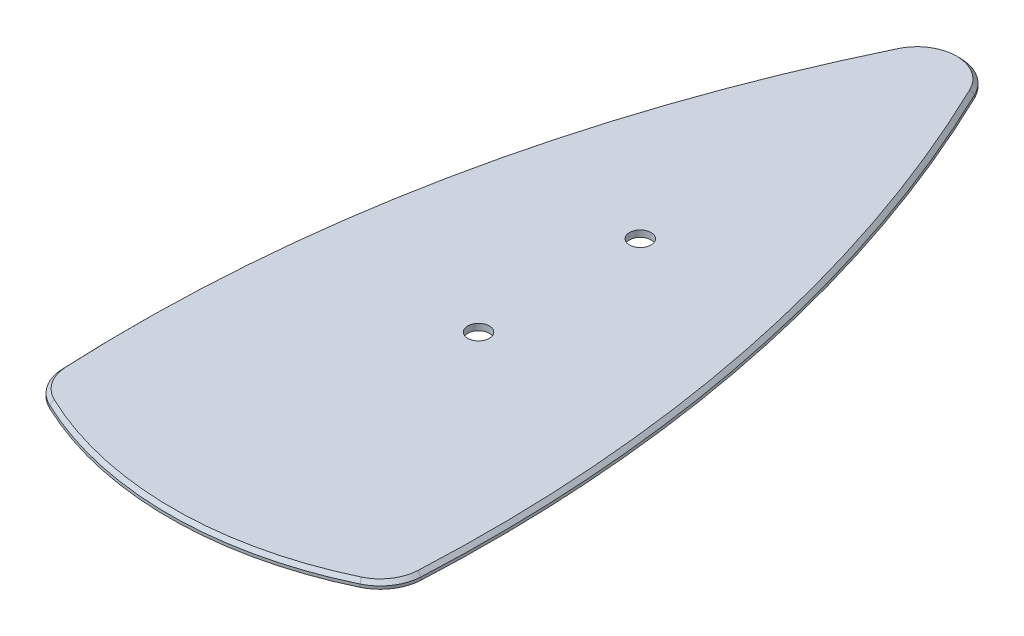
ISO-10303-21;
HEADER;
FILE_DESCRIPTION(('STEP AP214'),'2;1');
FILE_NAME('part.step','',(''),(''),'','','');
FILE_SCHEMA(('AUTOMOTIVE_DESIGN { 1 0 10303 214 1 1 1 1 }'));
ENDSEC;
DATA;
#1=APPLICATION_CONTEXT('core data for automotive mechanical design processes');
#2=APPLICATION_PROTOCOL_DEFINITION('international standard','automotive_design',2000,#1);
#3=PRODUCT_CONTEXT('',#1,'mechanical');
#4=PRODUCT('Part','Part','',(#3));
#5=PRODUCT_RELATED_PRODUCT_CATEGORY('part','',(#4));
#6=PRODUCT_DEFINITION_FORMATION('','',#4);
#7=PRODUCT_DEFINITION_CONTEXT('part definition',#1,'design');
#8=PRODUCT_DEFINITION('design','',#6,#7);
#9=PRODUCT_DEFINITION_SHAPE('','',#8);
#10=(LENGTH_UNIT() NAMED_UNIT(*) SI_UNIT(.MILLI.,.METRE.));
#11=(NAMED_UNIT(*) PLANE_ANGLE_UNIT() SI_UNIT($,.RADIAN.));
#12=(NAMED_UNIT(*) SI_UNIT($,.STERADIAN.) SOLID_ANGLE_UNIT());
#13=UNCERTAINTY_MEASURE_WITH_UNIT(LENGTH_MEASURE(1.E-05),#10,'distance_accuracy_value','');
#14=(GEOMETRIC_REPRESENTATION_CONTEXT(3) GLOBAL_UNCERTAINTY_ASSIGNED_CONTEXT((#13)) GLOBAL_UNIT_ASSIGNED_CONTEXT((#10,
#11,#12)) REPRESENTATION_CONTEXT('',''));
#15=CARTESIAN_POINT('',(0.,0.,0.));
#16=DIRECTION('',(0.,0.,1.));
#17=DIRECTION('',(1.,0.,0.));
#18=AXIS2_PLACEMENT_3D('',#15,#16,#17);
#19=CARTESIAN_POINT('',(1747.68597333076,-9.,352.136413310162));
#20=DIRECTION('',(0.,1.,0.));
#21=DIRECTION('',(0.,0.,1.));
#22=AXIS2_PLACEMENT_3D('',#19,#20,#21);
#23=CYLINDRICAL_SURFACE('',#22,2000.);
#24=DIRECTION('',(0.,1.,0.));
#25=VECTOR('',#24,1.);
#26=CARTESIAN_POINT('',(-249.928432164869,-9.,449.792375526169));
#27=LINE('',#26,#25);
#28=CARTESIAN_POINT('',(-249.928432164869,-9.,449.792375526169));
#29=VERTEX_POINT('',#28);
#30=CARTESIAN_POINT('',(-249.928432164869,-4.99999999999973,449.792375526169));
#31=VERTEX_POINT('',#30);
#32=EDGE_CURVE('E103',#29,#31,#27,.T.);
#33=ORIENTED_EDGE('',*,*,#32,.T.);
#34=CARTESIAN_POINT('',(1747.68597333076,-4.99999999999973,352.136413310162));
#35=DIRECTION('',(0.,1.,0.));
#36=DIRECTION('',(0.,0.,1.));
#37=AXIS2_PLACEMENT_3D('',#34,#35,#36);
#38=CIRCLE('',#37,2000.);
#39=CARTESIAN_POINT('',(-54.0521435050747,-4.99999999999973,-516.045456081757));
#40=VERTEX_POINT('',#39);
#41=EDGE_CURVE('E168',#31,#40,#38,.F.);
#42=ORIENTED_EDGE('',*,*,#41,.T.);
#43=DIRECTION('',(0.,1.,0.));
#44=VECTOR('',#43,1.);
#45=CARTESIAN_POINT('',(-54.0521435050747,-9.,-516.045456081757));
#46=LINE('',#45,#44);
#47=CARTESIAN_POINT('',(-54.0521435050747,-9.,-516.045456081757));
#48=VERTEX_POINT('',#47);
#49=EDGE_CURVE('E127',#48,#40,#46,.T.);
#50=ORIENTED_EDGE('',*,*,#49,.F.);
#51=CARTESIAN_POINT('',(1747.68597333076,-9.,352.136413310162));
#52=DIRECTION('',(0.,1.,0.));
#53=DIRECTION('',(0.,0.,1.));
#54=AXIS2_PLACEMENT_3D('',#51,#52,#53);
#55=CIRCLE('',#54,2000.);
#56=EDGE_CURVE('E120',#48,#29,#55,.T.);
#57=ORIENTED_EDGE('',*,*,#56,.T.);
#58=EDGE_LOOP('',(#33,#42,#50,#57));
#59=FACE_BOUND('',#58,.T.);
#60=ADVANCED_FACE('F32',(#59),#23,.T.);
#61=CARTESIAN_POINT('',(0.,-9.,-490.));
#62=DIRECTION('',(0.,1.,0.));
#63=DIRECTION('',(0.,0.,1.));
#64=AXIS2_PLACEMENT_3D('',#61,#62,#63);
#65=CYLINDRICAL_SURFACE('',#64,59.9999999999996);
#66=ORIENTED_EDGE('',*,*,#49,.T.);
#67=CARTESIAN_POINT('',(0.,-4.99999999999973,-490.));
#68=DIRECTION('',(0.,1.,0.));
#69=DIRECTION('',(0.,0.,1.));
#70=AXIS2_PLACEMENT_3D('',#67,#68,#69);
#71=CIRCLE('',#70,59.9999999999996);
#72=CARTESIAN_POINT('',(54.0521435050748,-4.99999999999973,-516.045456081757));
#73=VERTEX_POINT('',#72);
#74=EDGE_CURVE('E165',#40,#73,#71,.F.);
#75=ORIENTED_EDGE('',*,*,#74,.T.);
#76=DIRECTION('',(0.,1.,0.));
#77=VECTOR('',#76,1.);
#78=CARTESIAN_POINT('',(54.0521435050748,-9.,-516.045456081757));
#79=LINE('',#78,#77);
#80=CARTESIAN_POINT('',(54.0521435050748,-9.,-516.045456081757));
#81=VERTEX_POINT('',#80);
#82=EDGE_CURVE('E145',#81,#73,#79,.T.);
#83=ORIENTED_EDGE('',*,*,#82,.F.);
#84=CARTESIAN_POINT('',(0.,-9.,-490.));
#85=DIRECTION('',(0.,1.,0.));
#86=DIRECTION('',(0.,0.,-1.));
#87=AXIS2_PLACEMENT_3D('',#84,#85,#86);
#88=CIRCLE('',#87,59.9999999999996);
#89=EDGE_CURVE('E113',#81,#48,#88,.T.);
#90=ORIENTED_EDGE('',*,*,#89,.T.);
#91=EDGE_LOOP('',(#66,#75,#83,#90));
#92=FACE_BOUND('',#91,.T.);
#93=ADVANCED_FACE('F204',(#92),#65,.T.);
#94=CARTESIAN_POINT('',(-1747.68597333076,-9.,352.136413310163));
#95=DIRECTION('',(0.,1.,0.));
#96=DIRECTION('',(0.,0.,1.));
#97=AXIS2_PLACEMENT_3D('',#94,#95,#96);
#98=CYLINDRICAL_SURFACE('',#97,2000.);
#99=ORIENTED_EDGE('',*,*,#82,.T.);
#100=CARTESIAN_POINT('',(-1747.68597333076,-4.99999999999973,352.136413310163));
#101=DIRECTION('',(0.,1.,0.));
#102=DIRECTION('',(0.,0.,1.));
#103=AXIS2_PLACEMENT_3D('',#100,#101,#102);
#104=CIRCLE('',#103,2000.);
#105=CARTESIAN_POINT('',(249.928432164869,-4.99999999999973,449.792375526169));
#106=VERTEX_POINT('',#105);
#107=EDGE_CURVE('E170',#73,#106,#104,.F.);
#108=ORIENTED_EDGE('',*,*,#107,.T.);
#109=DIRECTION('',(0.,1.,0.));
#110=VECTOR('',#109,1.);
#111=CARTESIAN_POINT('',(249.928432164869,-9.,449.792375526169));
#112=LINE('',#111,#110);
#113=CARTESIAN_POINT('',(249.928432164869,-9.,449.792375526169));
#114=VERTEX_POINT('',#113);
#115=EDGE_CURVE('E148',#114,#106,#112,.T.);
#116=ORIENTED_EDGE('',*,*,#115,.F.);
#117=CARTESIAN_POINT('',(-1747.68597333076,-9.,352.136413310163));
#118=DIRECTION('',(0.,1.,0.));
#119=DIRECTION('',(0.,0.,-1.));
#120=AXIS2_PLACEMENT_3D('',#117,#118,#119);
#121=CIRCLE('',#120,2000.);
#122=EDGE_CURVE('E139',#114,#81,#121,.T.);
#123=ORIENTED_EDGE('',*,*,#122,.T.);
#124=EDGE_LOOP('',(#99,#108,#116,#123));
#125=FACE_BOUND('',#124,.T.);
#126=ADVANCED_FACE('F213',(#125),#98,.T.);
#127=CARTESIAN_POINT('',(190.,-9.,446.862696659689));
#128=DIRECTION('',(0.,1.,0.));
#129=DIRECTION('',(0.,0.,1.));
#130=AXIS2_PLACEMENT_3D('',#127,#128,#129);
#131=CYLINDRICAL_SURFACE('',#130,60.);
#132=ORIENTED_EDGE('',*,*,#115,.T.);
#133=CARTESIAN_POINT('',(190.,-4.99999999999973,446.862696659689));
#134=DIRECTION('',(0.,1.,0.));
#135=DIRECTION('',(0.,0.,1.));
#136=AXIS2_PLACEMENT_3D('',#133,#134,#135);
#137=CIRCLE('',#136,60.);
#138=CARTESIAN_POINT('',(215.909090909091,-4.99999999999973,500.980337113282));
#139=VERTEX_POINT('',#138);
#140=EDGE_CURVE('E41',#106,#139,#137,.F.);
#141=ORIENTED_EDGE('',*,*,#140,.T.);
#142=DIRECTION('',(0.,1.,0.));
#143=VECTOR('',#142,1.);
#144=CARTESIAN_POINT('',(215.909090909091,-9.,500.980337113282));
#145=LINE('',#144,#143);
#146=CARTESIAN_POINT('',(215.909090909091,-9.,500.980337113282));
#147=VERTEX_POINT('',#146);
#148=EDGE_CURVE('E150',#147,#139,#145,.T.);
#149=ORIENTED_EDGE('',*,*,#148,.F.);
#150=CARTESIAN_POINT('',(190.,-9.,446.862696659689));
#151=DIRECTION('',(0.,1.,0.));
#152=DIRECTION('',(0.,0.,-1.));
#153=AXIS2_PLACEMENT_3D('',#150,#151,#152);
#154=CIRCLE('',#153,60.);
#155=EDGE_CURVE('E136',#147,#114,#154,.T.);
#156=ORIENTED_EDGE('',*,*,#155,.T.);
#157=EDGE_LOOP('',(#132,#141,#149,#156));
#158=FACE_BOUND('',#157,.T.);
#159=ADVANCED_FACE('F215',(#158),#131,.T.);
#160=CARTESIAN_POINT('',(0.,-9.,50.));
#161=DIRECTION('',(0.,1.,0.));
#162=DIRECTION('',(0.,0.,1.));
#163=AXIS2_PLACEMENT_3D('',#160,#161,#162);
#164=CYLINDRICAL_SURFACE('',#163,500.);
#165=ORIENTED_EDGE('',*,*,#148,.T.);
#166=CARTESIAN_POINT('',(0.,-4.99999999999973,50.));
#167=DIRECTION('',(0.,1.,0.));
#168=DIRECTION('',(0.,0.,1.));
#169=AXIS2_PLACEMENT_3D('',#166,#167,#168);
#170=CIRCLE('',#169,500.);
#171=CARTESIAN_POINT('',(-215.909090909091,-4.99999999999973,500.980337113282));
#172=VERTEX_POINT('',#171);
#173=EDGE_CURVE('E11',#139,#172,#170,.F.);
#174=ORIENTED_EDGE('',*,*,#173,.T.);
#175=DIRECTION('',(0.,1.,0.));
#176=VECTOR('',#175,1.);
#177=CARTESIAN_POINT('',(-215.909090909091,-9.,500.980337113282));
#178=LINE('',#177,#176);
#179=CARTESIAN_POINT('',(-215.909090909091,-9.,500.980337113282));
#180=VERTEX_POINT('',#179);
#181=EDGE_CURVE('E112',#180,#172,#178,.T.);
#182=ORIENTED_EDGE('',*,*,#181,.F.);
#183=CARTESIAN_POINT('',(0.,-9.,50.));
#184=DIRECTION('',(0.,1.,0.));
#185=DIRECTION('',(0.,0.,1.));
#186=AXIS2_PLACEMENT_3D('',#183,#184,#185);
#187=CIRCLE('',#186,500.);
#188=EDGE_CURVE('E124',#180,#147,#187,.T.);
#189=ORIENTED_EDGE('',*,*,#188,.T.);
#190=EDGE_LOOP('',(#165,#174,#182,#189));
#191=FACE_BOUND('',#190,.T.);
#192=ADVANCED_FACE('F313',(#191),#164,.T.);
#193=CARTESIAN_POINT('',(-190.,-9.,446.862696659689));
#194=DIRECTION('',(0.,1.,0.));
#195=DIRECTION('',(0.,0.,1.));
#196=AXIS2_PLACEMENT_3D('',#193,#194,#195);
#197=CYLINDRICAL_SURFACE('',#196,59.9999999999999);
#198=ORIENTED_EDGE('',*,*,#181,.T.);
#199=CARTESIAN_POINT('',(-190.,-4.99999999999973,446.862696659689));
#200=DIRECTION('',(0.,1.,0.));
#201=DIRECTION('',(0.,0.,1.));
#202=AXIS2_PLACEMENT_3D('',#199,#200,#201);
#203=CIRCLE('',#202,59.9999999999999);
#204=EDGE_CURVE('E108',#172,#31,#203,.F.);
#205=ORIENTED_EDGE('',*,*,#204,.T.);
#206=ORIENTED_EDGE('',*,*,#32,.F.);
#207=CARTESIAN_POINT('',(-190.,-9.,446.862696659689));
#208=DIRECTION('',(0.,1.,0.));
#209=DIRECTION('',(0.,0.,1.));
#210=AXIS2_PLACEMENT_3D('',#207,#208,#209);
#211=CIRCLE('',#210,59.9999999999999);
#212=EDGE_CURVE('E106',#29,#180,#211,.T.);
#213=ORIENTED_EDGE('',*,*,#212,.T.);
#214=EDGE_LOOP('',(#198,#205,#206,#213));
#215=FACE_BOUND('',#214,.T.);
#216=ADVANCED_FACE('F105',(#215),#197,.T.);
#217=CARTESIAN_POINT('',(778.842986665382,-9.,399.499554984925));
#218=DIRECTION('',(0.,1.,0.));
#219=DIRECTION('',(0.,0.,1.));
#220=AXIS2_PLACEMENT_3D('',#217,#218,#219);
#221=PLANE('',#220);
#222=CARTESIAN_POINT('',(0.,-9.,120.));
#223=DIRECTION('',(0.,1.,0.));
#224=DIRECTION('',(0.,0.,1.));
#225=AXIS2_PLACEMENT_3D('',#222,#223,#224);
#226=CIRCLE('',#225,15.);
#227=CARTESIAN_POINT('',(0.,-9.,135.));
#228=VERTEX_POINT('',#227);
#229=EDGE_CURVE('E354',#228,#228,#226,.T.);
#230=ORIENTED_EDGE('',*,*,#229,.T.);
#231=EDGE_LOOP('',(#230));
#232=FACE_BOUND('',#231,.T.);
#233=CARTESIAN_POINT('',(0.,-9.,-105.));
#234=DIRECTION('',(0.,1.,0.));
#235=DIRECTION('',(0.,0.,1.));
#236=AXIS2_PLACEMENT_3D('',#233,#234,#235);
#237=CIRCLE('',#236,15.);
#238=CARTESIAN_POINT('',(0.,-9.,-90.));
#239=VERTEX_POINT('',#238);
#240=EDGE_CURVE('E177',#239,#239,#237,.T.);
#241=ORIENTED_EDGE('',*,*,#240,.T.);
#242=EDGE_LOOP('',(#241));
#243=FACE_BOUND('',#242,.T.);
#244=ORIENTED_EDGE('',*,*,#56,.F.);
#245=ORIENTED_EDGE('',*,*,#89,.F.);
#246=ORIENTED_EDGE('',*,*,#122,.F.);
#247=ORIENTED_EDGE('',*,*,#155,.F.);
#248=ORIENTED_EDGE('',*,*,#188,.F.);
#249=ORIENTED_EDGE('',*,*,#212,.F.);
#250=EDGE_LOOP('',(#244,#245,#246,#247,#248,#249));
#251=FACE_BOUND('',#250,.T.);
#252=ADVANCED_FACE('F118',(#232,#243,#251),#221,.F.);
#253=CARTESIAN_POINT('',(778.842986665382,0.,399.499554984925));
#254=DIRECTION('',(0.,1.,0.));
#255=DIRECTION('',(0.,0.,1.));
#256=AXIS2_PLACEMENT_3D('',#253,#254,#255);
#257=PLANE('',#256);
#258=CARTESIAN_POINT('',(0.,0.,120.));
#259=DIRECTION('',(0.,1.,0.));
#260=DIRECTION('',(0.,0.,1.));
#261=AXIS2_PLACEMENT_3D('',#258,#259,#260);
#262=CIRCLE('',#261,15.);
#263=CARTESIAN_POINT('',(0.,0.,135.));
#264=VERTEX_POINT('',#263);
#265=EDGE_CURVE('E359',#264,#264,#262,.T.);
#266=ORIENTED_EDGE('',*,*,#265,.F.);
#267=EDGE_LOOP('',(#266));
#268=FACE_BOUND('',#267,.T.);
#269=CARTESIAN_POINT('',(0.,0.,-105.));
#270=DIRECTION('',(0.,1.,0.));
#271=DIRECTION('',(0.,0.,1.));
#272=AXIS2_PLACEMENT_3D('',#269,#270,#271);
#273=CIRCLE('',#272,15.);
#274=CARTESIAN_POINT('',(0.,0.,-90.));
#275=VERTEX_POINT('',#274);
#276=EDGE_CURVE('E132',#275,#275,#273,.T.);
#277=ORIENTED_EDGE('',*,*,#276,.F.);
#278=EDGE_LOOP('',(#277));
#279=FACE_BOUND('',#278,.T.);
#280=CARTESIAN_POINT('',(-1747.68597333076,0.,352.136413310163));
#281=DIRECTION('',(0.,1.,0.));
#282=DIRECTION('',(0.,0.,1.));
#283=AXIS2_PLACEMENT_3D('',#280,#281,#282);
#284=CIRCLE('',#283,1995.);
#285=CARTESIAN_POINT('',(244.93439615113,0.,449.548235620629));
#286=VERTEX_POINT('',#285);
#287=CARTESIAN_POINT('',(49.5477982129853,0.,-513.875001408278));
#288=VERTEX_POINT('',#287);
#289=EDGE_CURVE('E158',#286,#288,#284,.T.);
#290=ORIENTED_EDGE('',*,*,#289,.T.);
#291=CARTESIAN_POINT('',(0.,0.,-490.));
#292=DIRECTION('',(0.,1.,0.));
#293=DIRECTION('',(0.,0.,1.));
#294=AXIS2_PLACEMENT_3D('',#291,#292,#293);
#295=CIRCLE('',#294,54.9999999999998);
#296=CARTESIAN_POINT('',(-49.5477982129853,0.,-513.875001408278));
#297=VERTEX_POINT('',#296);
#298=EDGE_CURVE('E162',#288,#297,#295,.T.);
#299=ORIENTED_EDGE('',*,*,#298,.T.);
#300=CARTESIAN_POINT('',(1747.68597333076,0.,352.136413310162));
#301=DIRECTION('',(0.,1.,0.));
#302=DIRECTION('',(0.,0.,1.));
#303=AXIS2_PLACEMENT_3D('',#300,#301,#302);
#304=CIRCLE('',#303,1995.);
#305=CARTESIAN_POINT('',(-244.93439615113,0.,449.548235620629));
#306=VERTEX_POINT('',#305);
#307=EDGE_CURVE('E160',#297,#306,#304,.T.);
#308=ORIENTED_EDGE('',*,*,#307,.T.);
#309=CARTESIAN_POINT('',(-190.,0.,446.862696659689));
#310=DIRECTION('',(0.,1.,0.));
#311=DIRECTION('',(0.,0.,1.));
#312=AXIS2_PLACEMENT_3D('',#309,#310,#311);
#313=CIRCLE('',#312,55.0000000000002);
#314=CARTESIAN_POINT('',(-213.75,0.,496.47053374215));
#315=VERTEX_POINT('',#314);
#316=EDGE_CURVE('E156',#306,#315,#313,.T.);
#317=ORIENTED_EDGE('',*,*,#316,.T.);
#318=CARTESIAN_POINT('',(0.,0.,50.));
#319=DIRECTION('',(0.,1.,0.));
#320=DIRECTION('',(0.,0.,1.));
#321=AXIS2_PLACEMENT_3D('',#318,#319,#320);
#322=CIRCLE('',#321,495.);
#323=CARTESIAN_POINT('',(213.75,0.,496.47053374215));
#324=VERTEX_POINT('',#323);
#325=EDGE_CURVE('E144',#315,#324,#322,.T.);
#326=ORIENTED_EDGE('',*,*,#325,.T.);
#327=CARTESIAN_POINT('',(190.,0.,446.862696659689));
#328=DIRECTION('',(0.,1.,0.));
#329=DIRECTION('',(0.,0.,1.));
#330=AXIS2_PLACEMENT_3D('',#327,#328,#329);
#331=CIRCLE('',#330,55.0000000000002);
#332=EDGE_CURVE('E154',#324,#286,#331,.T.);
#333=ORIENTED_EDGE('',*,*,#332,.T.);
#334=EDGE_LOOP('',(#290,#299,#308,#317,#326,#333));
#335=FACE_BOUND('',#334,.T.);
#336=ADVANCED_FACE('F194',(#268,#279,#335),#257,.T.);
#337=CARTESIAN_POINT('',(0.,0.,50.));
#338=DIRECTION('',(0.,-1.,0.));
#339=DIRECTION('',(0.,0.,-1.));
#340=AXIS2_PLACEMENT_3D('',#337,#338,#339);
#341=CONICAL_SURFACE('',#340,495.,0.785398163397454);
#342=DIRECTION('',(0.305341564603289,0.70710678118654,-0.637782509109199));
#343=VECTOR('',#342,1.);
#344=CARTESIAN_POINT('',(-215.909090909091,-4.99999999999973,500.980337113282));
#345=LINE('',#344,#343);
#346=EDGE_CURVE('E130',#172,#315,#345,.T.);
#347=ORIENTED_EDGE('',*,*,#346,.F.);
#348=ORIENTED_EDGE('',*,*,#173,.F.);
#349=DIRECTION('',(0.305341564603281,-0.70710678118655,0.637782509109192));
#350=VECTOR('',#349,1.);
#351=CARTESIAN_POINT('',(213.75,0.,496.47053374215));
#352=LINE('',#351,#350);
#353=EDGE_CURVE('E36',#324,#139,#352,.T.);
#354=ORIENTED_EDGE('',*,*,#353,.F.);
#355=ORIENTED_EDGE('',*,*,#325,.F.);
#356=EDGE_LOOP('',(#347,#348,#354,#355));
#357=FACE_BOUND('',#356,.T.);
#358=ADVANCED_FACE('F34',(#357),#341,.T.);
#359=CARTESIAN_POINT('',(190.,0.,446.862696659689));
#360=DIRECTION('',(0.,-1.,0.));
#361=DIRECTION('',(0.,0.,-1.));
#362=AXIS2_PLACEMENT_3D('',#359,#360,#361);
#363=CONICAL_SURFACE('',#362,55.0000000000002,0.785398163397456);
#364=ORIENTED_EDGE('',*,*,#353,.T.);
#365=ORIENTED_EDGE('',*,*,#140,.F.);
#366=DIRECTION('',(0.706263346160952,-0.707106781186542,0.0345265965531183));
#367=VECTOR('',#366,1.);
#368=CARTESIAN_POINT('',(244.93439615113,0.,449.548235620629));
#369=LINE('',#368,#367);
#370=EDGE_CURVE('E182',#286,#106,#369,.T.);
#371=ORIENTED_EDGE('',*,*,#370,.F.);
#372=ORIENTED_EDGE('',*,*,#332,.F.);
#373=EDGE_LOOP('',(#364,#365,#371,#372));
#374=FACE_BOUND('',#373,.T.);
#375=ADVANCED_FACE('F217',(#374),#363,.T.);
#376=CARTESIAN_POINT('',(-190.,0.,446.862696659689));
#377=DIRECTION('',(0.,-1.,0.));
#378=DIRECTION('',(0.,0.,-1.));
#379=AXIS2_PLACEMENT_3D('',#376,#377,#378);
#380=CONICAL_SURFACE('',#379,55.0000000000001,0.785398163397455);
#381=ORIENTED_EDGE('',*,*,#346,.T.);
#382=ORIENTED_EDGE('',*,*,#316,.F.);
#383=DIRECTION('',(0.70626334616095,0.707106781186544,-0.0345265965531183));
#384=VECTOR('',#383,1.);
#385=CARTESIAN_POINT('',(-249.928432164869,-4.99999999999973,449.792375526169));
#386=LINE('',#385,#384);
#387=EDGE_CURVE('E179',#31,#306,#386,.T.);
#388=ORIENTED_EDGE('',*,*,#387,.F.);
#389=ORIENTED_EDGE('',*,*,#204,.F.);
#390=EDGE_LOOP('',(#381,#382,#388,#389));
#391=FACE_BOUND('',#390,.T.);
#392=ADVANCED_FACE('F188',(#391),#380,.T.);
#393=CARTESIAN_POINT('',(-1747.68597333076,0.,352.136413310163));
#394=DIRECTION('',(0.,-1.,0.));
#395=DIRECTION('',(0.,0.,-1.));
#396=AXIS2_PLACEMENT_3D('',#393,#394,#395);
#397=CONICAL_SURFACE('',#396,1995.,0.785398163397465);
#398=ORIENTED_EDGE('',*,*,#370,.T.);
#399=ORIENTED_EDGE('',*,*,#107,.F.);
#400=DIRECTION('',(0.637010620168457,-0.707106781186544,-0.306948643575114));
#401=VECTOR('',#400,1.);
#402=CARTESIAN_POINT('',(49.5477982129853,0.,-513.875001408278));
#403=LINE('',#402,#401);
#404=EDGE_CURVE('E176',#288,#73,#403,.T.);
#405=ORIENTED_EDGE('',*,*,#404,.F.);
#406=ORIENTED_EDGE('',*,*,#289,.F.);
#407=EDGE_LOOP('',(#398,#399,#405,#406));
#408=FACE_BOUND('',#407,.T.);
#409=ADVANCED_FACE('F211',(#408),#397,.T.);
#410=CARTESIAN_POINT('',(1747.68597333076,0.,352.136413310162));
#411=DIRECTION('',(0.,-1.,0.));
#412=DIRECTION('',(0.,0.,-1.));
#413=AXIS2_PLACEMENT_3D('',#410,#411,#412);
#414=CONICAL_SURFACE('',#413,1995.,0.785398163397465);
#415=ORIENTED_EDGE('',*,*,#387,.T.);
#416=ORIENTED_EDGE('',*,*,#307,.F.);
#417=DIRECTION('',(0.637010620168471,0.707106781186528,0.306948643575123));
#418=VECTOR('',#417,1.);
#419=CARTESIAN_POINT('',(-54.0521435050749,-4.99999999999973,-516.045456081758));
#420=LINE('',#419,#418);
#421=EDGE_CURVE('E174',#40,#297,#420,.T.);
#422=ORIENTED_EDGE('',*,*,#421,.F.);
#423=ORIENTED_EDGE('',*,*,#41,.F.);
#424=EDGE_LOOP('',(#415,#416,#422,#423));
#425=FACE_BOUND('',#424,.T.);
#426=ADVANCED_FACE('F200',(#425),#414,.T.);
#427=CARTESIAN_POINT('',(0.,0.,-490.));
#428=DIRECTION('',(0.,-1.,0.));
#429=DIRECTION('',(0.,0.,-1.));
#430=AXIS2_PLACEMENT_3D('',#427,#428,#429);
#431=CONICAL_SURFACE('',#430,54.9999999999998,0.785398163397453);
#432=ORIENTED_EDGE('',*,*,#404,.T.);
#433=ORIENTED_EDGE('',*,*,#74,.F.);
#434=ORIENTED_EDGE('',*,*,#421,.T.);
#435=ORIENTED_EDGE('',*,*,#298,.F.);
#436=EDGE_LOOP('',(#432,#433,#434,#435));
#437=FACE_BOUND('',#436,.T.);
#438=ADVANCED_FACE('F206',(#437),#431,.T.);
#439=CARTESIAN_POINT('',(0.,-9.,-105.));
#440=DIRECTION('',(0.,1.,0.));
#441=DIRECTION('',(0.,0.,1.));
#442=AXIS2_PLACEMENT_3D('',#439,#440,#441);
#443=CYLINDRICAL_SURFACE('',#442,15.);
#444=ORIENTED_EDGE('',*,*,#240,.F.);
#445=EDGE_LOOP('',(#444));
#446=FACE_BOUND('',#445,.T.);
#447=ORIENTED_EDGE('',*,*,#276,.T.);
#448=EDGE_LOOP('',(#447));
#449=FACE_BOUND('',#448,.T.);
#450=ADVANCED_FACE('F235',(#446,#449),#443,.F.);
#451=CARTESIAN_POINT('',(0.,-9.,120.));
#452=DIRECTION('',(0.,1.,0.));
#453=DIRECTION('',(0.,0.,1.));
#454=AXIS2_PLACEMENT_3D('',#451,#452,#453);
#455=CYLINDRICAL_SURFACE('',#454,15.);
#456=ORIENTED_EDGE('',*,*,#229,.F.);
#457=EDGE_LOOP('',(#456));
#458=FACE_BOUND('',#457,.T.);
#459=ORIENTED_EDGE('',*,*,#265,.T.);
#460=EDGE_LOOP('',(#459));
#461=FACE_BOUND('',#460,.T.);
#462=ADVANCED_FACE('F258',(#458,#461),#455,.F.);
#463=CLOSED_SHELL('',(#60,#93,#126,#159,#192,#216,#252,#336,#358,#375,#392,#409,#426,#438,#450,#462));
#464=MANIFOLD_SOLID_BREP('B2',#463);
#465=ADVANCED_BREP_SHAPE_REPRESENTATION('',(#18,#464),#14);
#466=SHAPE_DEFINITION_REPRESENTATION(#9,#465);
ENDSEC;
END-ISO-10303-21;
